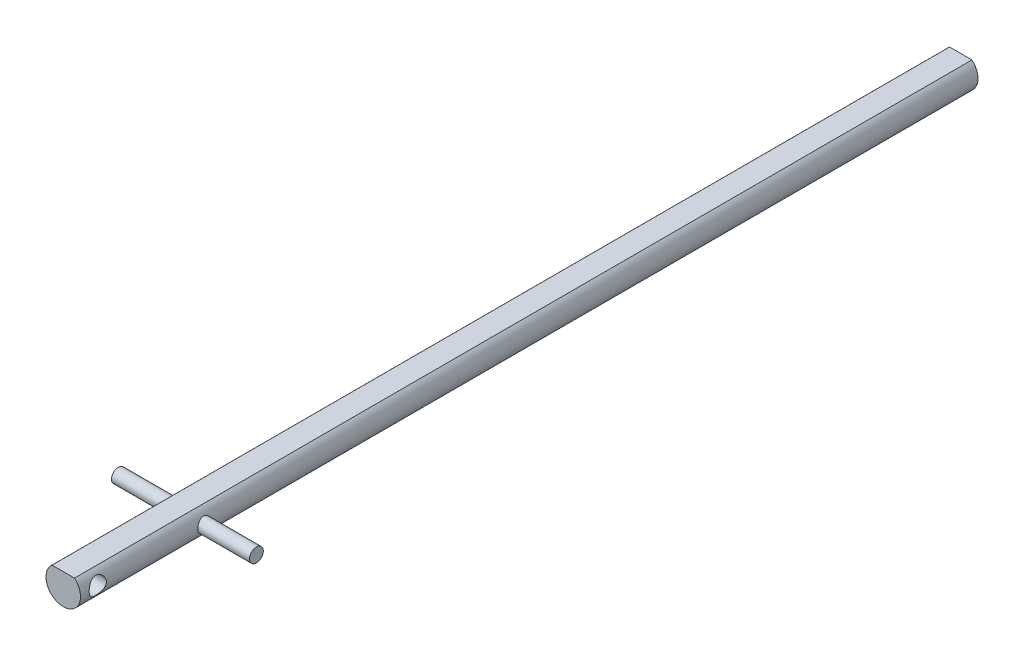
ISO-10303-21;
HEADER;
FILE_DESCRIPTION(('STEP AP214'),'2;1');
FILE_NAME('part.step','',(''),(''),'','','');
FILE_SCHEMA(('AUTOMOTIVE_DESIGN { 1 0 10303 214 1 1 1 1 }'));
ENDSEC;
DATA;
#1=APPLICATION_CONTEXT('core data for automotive mechanical design processes');
#2=APPLICATION_PROTOCOL_DEFINITION('international standard','automotive_design',2000,#1);
#3=PRODUCT_CONTEXT('',#1,'mechanical');
#4=PRODUCT('Part','Part','',(#3));
#5=PRODUCT_RELATED_PRODUCT_CATEGORY('part','',(#4));
#6=PRODUCT_DEFINITION_FORMATION('','',#4);
#7=PRODUCT_DEFINITION_CONTEXT('part definition',#1,'design');
#8=PRODUCT_DEFINITION('design','',#6,#7);
#9=PRODUCT_DEFINITION_SHAPE('','',#8);
#10=(LENGTH_UNIT() NAMED_UNIT(*) SI_UNIT(.MILLI.,.METRE.));
#11=(NAMED_UNIT(*) PLANE_ANGLE_UNIT() SI_UNIT($,.RADIAN.));
#12=(NAMED_UNIT(*) SI_UNIT($,.STERADIAN.) SOLID_ANGLE_UNIT());
#13=UNCERTAINTY_MEASURE_WITH_UNIT(LENGTH_MEASURE(1.E-05),#10,'distance_accuracy_value','');
#14=(GEOMETRIC_REPRESENTATION_CONTEXT(3) GLOBAL_UNCERTAINTY_ASSIGNED_CONTEXT((#13)) GLOBAL_UNIT_ASSIGNED_CONTEXT((#10,
#11,#12)) REPRESENTATION_CONTEXT('',''));
#15=CARTESIAN_POINT('',(0.,0.,0.));
#16=DIRECTION('',(0.,0.,1.));
#17=DIRECTION('',(1.,0.,0.));
#18=AXIS2_PLACEMENT_3D('',#15,#16,#17);
#19=CARTESIAN_POINT('',(0.,0.,260.));
#20=DIRECTION('',(0.,0.,-1.));
#21=DIRECTION('',(-1.,0.,0.));
#22=AXIS2_PLACEMENT_3D('',#19,#20,#21);
#23=CYLINDRICAL_SURFACE('',#22,5.);
#24=CARTESIAN_POINT('',(5.,0.,226.038713000911));
#25=CARTESIAN_POINT('',(4.99999271227084,-0.107493005442891,226.038703149087));
#26=CARTESIAN_POINT('',(4.99649294306932,-0.215172564090672,226.029995248822));
#27=CARTESIAN_POINT('',(4.98283453100641,-0.427496480417894,225.995465297389));
#28=CARTESIAN_POINT('',(4.97265778698877,-0.532131777561247,225.969596721824));
#29=CARTESIAN_POINT('',(4.94674209213118,-0.7349539227274,225.901836922852));
#30=CARTESIAN_POINT('',(4.93102136364072,-0.833160661616954,225.859998154694));
#31=CARTESIAN_POINT('',(4.89556610796078,-1.02107197032836,225.761693827584));
#32=CARTESIAN_POINT('',(4.87583297458057,-1.11077947675098,225.705233345992));
#33=CARTESIAN_POINT('',(4.83330886170419,-1.28350100757038,225.57647750235));
#34=CARTESIAN_POINT('',(4.81042296929191,-1.3660622725502,225.50360634467));
#35=CARTESIAN_POINT('',(4.76460576906195,-1.51817500478471,225.345312997434));
#36=CARTESIAN_POINT('',(4.74167444453793,-1.58772010713352,225.259884703699));
#37=CARTESIAN_POINT('',(4.69722791797136,-1.71487456729287,225.074284930668));
#38=CARTESIAN_POINT('',(4.67582115964952,-1.77181498119546,224.973626514887));
#39=CARTESIAN_POINT('',(4.63833647186793,-1.86775471903714,224.763176602491));
#40=CARTESIAN_POINT('',(4.62225601244176,-1.90676256428583,224.653389473062));
#41=CARTESIAN_POINT('',(4.59826357660818,-1.96389882339587,224.433000667318));
#42=CARTESIAN_POINT('',(4.59001420355605,-1.98289396580564,224.322661765334));
#43=CARTESIAN_POINT('',(4.58164004049144,-2.00217296164002,224.100078002603));
#44=CARTESIAN_POINT('',(4.58151125522768,-2.00246601631322,223.987834106286));
#45=CARTESIAN_POINT('',(4.58910500279994,-1.98498936750455,223.772956329453));
#46=CARTESIAN_POINT('',(4.5962817503845,-1.96847531430514,223.670197286502));
#47=CARTESIAN_POINT('',(4.61676187607836,-1.91994688029782,223.469053444904));
#48=CARTESIAN_POINT('',(4.63006632321673,-1.88792979480463,223.3706694128));
#49=CARTESIAN_POINT('',(4.6615948508853,-1.80869473255108,223.178695164715));
#50=CARTESIAN_POINT('',(4.67991379280788,-1.76117986231532,223.085243761856));
#51=CARTESIAN_POINT('',(4.7193811638989,-1.65250646073221,222.907297184549));
#52=CARTESIAN_POINT('',(4.74053065456848,-1.59134280510084,222.822805391508));
#53=CARTESIAN_POINT('',(4.7852673674227,-1.45155059945444,222.658303272109));
#54=CARTESIAN_POINT('',(4.80891664976151,-1.37193746297065,222.579144271465));
#55=CARTESIAN_POINT('',(4.85459824958281,-1.20031442743021,222.435028522909));
#56=CARTESIAN_POINT('',(4.87663024445324,-1.10830206533445,222.3700746035));
#57=CARTESIAN_POINT('',(4.91714681264548,-0.912077652605853,222.255095553495));
#58=CARTESIAN_POINT('',(4.93555270095414,-0.807660491346491,222.205390719714));
#59=CARTESIAN_POINT('',(4.96614828328759,-0.591023765482894,222.124545139833));
#60=CARTESIAN_POINT('',(4.97834113462382,-0.478808196849682,222.093394963353));
#61=CARTESIAN_POINT('',(4.9945613950691,-0.256895887607824,222.052264705491));
#62=CARTESIAN_POINT('',(4.99902945833514,-0.147443293985539,222.041140546657));
#63=CARTESIAN_POINT('',(5.00068478510631,0.0718453098078124,222.036999900382));
#64=CARTESIAN_POINT('',(4.99787393582291,0.181681213223919,222.043978719363));
#65=CARTESIAN_POINT('',(4.98557567063753,0.393432739121984,222.075004753463));
#66=CARTESIAN_POINT('',(4.97639391345523,0.495482491775472,222.098270981262));
#67=CARTESIAN_POINT('',(4.952594414055,0.694135428060778,222.16014870922));
#68=CARTESIAN_POINT('',(4.9379759735653,0.790737910224842,222.198762180579));
#69=CARTESIAN_POINT('',(4.90416594770812,0.979078785816701,222.291497940591));
#70=CARTESIAN_POINT('',(4.88484815979803,1.07057802275541,222.346058472954));
#71=CARTESIAN_POINT('',(4.84373364745525,1.24344359124656,222.468653324816));
#72=CARTESIAN_POINT('',(4.8219359311027,1.32480584076113,222.536693043833));
#73=CARTESIAN_POINT('',(4.77645117638112,1.48072304302882,222.68958301386));
#74=CARTESIAN_POINT('',(4.75273441425052,1.55447393380607,222.775246542417));
#75=CARTESIAN_POINT('',(4.70741672917132,1.68675119741371,222.95815308392));
#76=CARTESIAN_POINT('',(4.68581615526511,1.74527506133751,223.055398001251));
#77=CARTESIAN_POINT('',(4.64714299907709,1.84580750193162,223.260174695505));
#78=CARTESIAN_POINT('',(4.63011630884788,1.88765059453445,223.367797000123));
#79=CARTESIAN_POINT('',(4.60323673477932,1.9522962197053,223.589446652626));
#80=CARTESIAN_POINT('',(4.59337855695998,1.97511280526931,223.703469206723));
#81=CARTESIAN_POINT('',(4.58271759299927,1.99971561727839,223.925840902685));
#82=CARTESIAN_POINT('',(4.58131421008172,2.00289708230286,224.034007840504));
#83=CARTESIAN_POINT('',(4.58614836033098,1.99180315927752,224.249257858624));
#84=CARTESIAN_POINT('',(4.59238492324793,1.97752998791378,224.356341074813));
#85=CARTESIAN_POINT('',(4.61126649079021,1.93307136615365,224.562045190766));
#86=CARTESIAN_POINT('',(4.62364831827449,1.90353749357098,224.660833275344));
#87=CARTESIAN_POINT('',(4.65324001232696,1.83000544849102,224.852091630524));
#88=CARTESIAN_POINT('',(4.67045121206006,1.78600328139382,224.94456014781));
#89=CARTESIAN_POINT('',(4.70898609604491,1.68187276275974,225.126322620181));
#90=CARTESIAN_POINT('',(4.73048882313242,1.62096533515949,225.215131671041));
#91=CARTESIAN_POINT('',(4.77463804372237,1.48589211927149,225.381706318114));
#92=CARTESIAN_POINT('',(4.79728488048406,1.41172233481813,225.459468573039));
#93=CARTESIAN_POINT('',(4.84293567087394,1.24650550627247,225.606915854174));
#94=CARTESIAN_POINT('',(4.86586757962185,1.15467600114614,225.675750307809));
#95=CARTESIAN_POINT('',(4.90800406713717,0.95990032028578,225.797050043532));
#96=CARTESIAN_POINT('',(4.92720691092906,0.856949004547245,225.849507713063));
#97=CARTESIAN_POINT('',(4.95939714815861,0.644738062495213,225.935335216101));
#98=CARTESIAN_POINT('',(4.97249363055028,0.535631618219702,225.969042324471));
#99=CARTESIAN_POINT('',(4.99144306209366,0.312876546281223,226.017352121865));
#100=CARTESIAN_POINT('',(4.99731899495638,0.199243525858915,226.032015437655));
#101=CARTESIAN_POINT('',(4.99975899504136,0.0569122978909315,226.038108381889));
#102=CARTESIAN_POINT('',(5.00000192969176,0.0284626887407593,226.03871560954));
#103=CARTESIAN_POINT('',(5.,0.,226.038713000911));
#104=B_SPLINE_CURVE_WITH_KNOTS('',3,(#24,#25,#26,#27,#28,#29,#30,#31,#32,#33,#34,#35,#36,#37,
#38,#39,#40,#41,#42,#43,#44,#45,#46,#47,#48,#49,#50,#51,#52,#53,#54,#55,#56,#57,#58,#59,#60,#61,
#62,#63,#64,#65,#66,#67,#68,#69,#70,#71,#72,#73,#74,#75,#76,#77,#78,#79,#80,#81,#82,#83,#84,#85,
#86,#87,#88,#89,#90,#91,#92,#93,#94,#95,#96,#97,#98,#99,#100,#101,#102,#103),.UNSPECIFIED.,.T.,
.F.,(4,2,2,2,2,2,2,2,2,2,2,2,2,2,2,2,2,2,2,2,2,2,2,2,2,2,2,2,2,2,2,2,2,2,2,2,2,2,2,4),(0.,
0.322402987893068,0.645683636007934,0.967911457471578,1.29002753567984,1.62597381700394,
1.9620839493441,2.31315258819216,2.66405423118269,2.99904105308828,3.33386306340483,
3.6453832840137,3.95695787256046,4.27489126298814,4.59294421938181,4.93558349186554,
5.27829092839729,5.62776913162804,5.97706956113789,6.30569184528006,6.63422893570081,
6.94800455564364,7.26182048993795,7.58523513398262,7.90877959498968,8.25368474624413,
8.59864669043749,8.94695045140825,9.29499672645931,9.61799673392744,9.94095572563044,
10.2511431854876,10.5614163580516,10.8894546805669,11.2175920134839,11.5670042353383,
11.9165786364053,12.2596430101332,12.6016125240434,12.6869804589679),.UNSPECIFIED.);
#105=CARTESIAN_POINT('',(5.,0.,226.038713000911));
#106=VERTEX_POINT('',#105);
#107=EDGE_CURVE('E42',#106,#106,#104,.T.);
#108=ORIENTED_EDGE('',*,*,#107,.F.);
#109=EDGE_LOOP('',(#108));
#110=FACE_BOUND('',#109,.T.);
#111=CARTESIAN_POINT('',(-5.,0.,252.5));
#112=CARTESIAN_POINT('',(-4.99999177550472,0.131426682334307,252.500009669056));
#113=CARTESIAN_POINT('',(-4.99476199135277,0.263015634437214,252.510425561774));
#114=CARTESIAN_POINT('',(-4.9743541856102,0.522301454622884,252.551631821162));
#115=CARTESIAN_POINT('',(-4.9591572718767,0.649990448564107,252.582460880925));
#116=CARTESIAN_POINT('',(-4.92040690922476,0.897333631316209,252.662984622719));
#117=CARTESIAN_POINT('',(-4.89688595907259,1.01701694536278,252.712605987783));
#118=CARTESIAN_POINT('',(-4.84364443325827,1.24618160399672,252.828926526252));
#119=CARTESIAN_POINT('',(-4.8139243464442,1.35566375203771,252.895624353145));
#120=CARTESIAN_POINT('',(-4.74890645050631,1.56876952630999,253.048793131643));
#121=CARTESIAN_POINT('',(-4.7133799765909,1.67163802294311,253.13621620023));
#122=CARTESIAN_POINT('',(-4.6414992577673,1.86194861703335,253.326303695985));
#123=CARTESIAN_POINT('',(-4.60514440566896,1.94937895911558,253.42897962884));
#124=CARTESIAN_POINT('',(-4.5324737794562,2.1131299996725,253.656208374445));
#125=CARTESIAN_POINT('',(-4.49637967412565,2.18806333849068,253.781840246035));
#126=CARTESIAN_POINT('',(-4.43214946943553,2.31542056761495,254.045918339795));
#127=CARTESIAN_POINT('',(-4.4040076902079,2.36786053751685,254.184355321763));
#128=CARTESIAN_POINT('',(-4.36144667591401,2.44533110537654,254.461662763596));
#129=CARTESIAN_POINT('',(-4.34630678958451,2.4718146426758,254.60001113018));
#130=CARTESIAN_POINT('',(-4.32954724872149,2.50106748329743,254.879947094438));
#131=CARTESIAN_POINT('',(-4.32791423358428,2.50386022093908,255.021531352175));
#132=CARTESIAN_POINT('',(-4.33777325642935,2.48671821792514,255.285715060791));
#133=CARTESIAN_POINT('',(-4.34771909154983,2.46946139884058,255.408560078058));
#134=CARTESIAN_POINT('',(-4.37690571834673,2.41734962264387,255.649304773432));
#135=CARTESIAN_POINT('',(-4.39614947079452,2.38248905974457,255.767202863263));
#136=CARTESIAN_POINT('',(-4.44218691031837,2.29552445096462,255.998072831414));
#137=CARTESIAN_POINT('',(-4.46914601659991,2.2430376677899,256.110865996965));
#138=CARTESIAN_POINT('',(-4.52758510703512,2.12260421917014,256.326585731475));
#139=CARTESIAN_POINT('',(-4.55906711950476,2.05465060953123,256.429507839));
#140=CARTESIAN_POINT('',(-4.62782894758212,1.89516513728196,256.636303131858));
#141=CARTESIAN_POINT('',(-4.66533775591864,1.80173614592322,256.73864218394));
#142=CARTESIAN_POINT('',(-4.73869058251018,1.59888894685347,256.926838546477));
#143=CARTESIAN_POINT('',(-4.77453379897002,1.48946314143575,257.012687980085));
#144=CARTESIAN_POINT('',(-4.84254968207408,1.25129126457966,257.169214152574));
#145=CARTESIAN_POINT('',(-4.87447460405014,1.12188397899857,257.239001181114));
#146=CARTESIAN_POINT('',(-4.92894702803108,0.851165538722017,257.355242572607));
#147=CARTESIAN_POINT('',(-4.95150197358893,0.709863940663192,257.401715462538));
#148=CARTESIAN_POINT('',(-4.98310834353579,0.431916229151808,257.466188509292));
#149=CARTESIAN_POINT('',(-4.9931234575324,0.295853826370934,257.486228089367));
#150=CARTESIAN_POINT('',(-5.00182533647793,0.0219489998733153,257.503661827836));
#151=CARTESIAN_POINT('',(-5.00051746803426,-0.115892549675083,257.501066714099));
#152=CARTESIAN_POINT('',(-4.98727980633468,-0.378082429964635,257.474483278953));
#153=CARTESIAN_POINT('',(-4.97618114219992,-0.50264852012369,257.452168668176));
#154=CARTESIAN_POINT('',(-4.94555428287529,-0.746017230755962,257.389404820262));
#155=CARTESIAN_POINT('',(-4.92602515837625,-0.864819214231875,257.348953583864));
#156=CARTESIAN_POINT('',(-4.87960628532329,-1.09722152111965,257.25000383392));
#157=CARTESIAN_POINT('',(-4.85252204417873,-1.21057599249831,257.191022374718));
#158=CARTESIAN_POINT('',(-4.7935993579975,-1.42615340426439,257.057231160875));
#159=CARTESIAN_POINT('',(-4.76175888940534,-1.52837157450204,256.98241466348));
#160=CARTESIAN_POINT('',(-4.69270553315086,-1.72941922315488,256.810598936709));
#161=CARTESIAN_POINT('',(-4.65527212009487,-1.82693019428497,256.712142829025));
#162=CARTESIAN_POINT('',(-4.58155978921586,-2.00464080257221,256.500187121951));
#163=CARTESIAN_POINT('',(-4.54528168472407,-2.08482846428686,256.38667720293));
#164=CARTESIAN_POINT('',(-4.47627980545279,-2.22926978618997,256.140890864515));
#165=CARTESIAN_POINT('',(-4.44381323981252,-2.29256373922246,256.007971834709));
#166=CARTESIAN_POINT('',(-4.38935180726744,-2.39520706511461,255.731224831117));
#167=CARTESIAN_POINT('',(-4.36734345549012,-2.43458729077058,255.587411184));
#168=CARTESIAN_POINT('',(-4.3390375256935,-2.48465421767007,255.307724442637));
#169=CARTESIAN_POINT('',(-4.33143458674095,-2.49773248744362,255.172414365881));
#170=CARTESIAN_POINT('',(-4.32913386592578,-2.50172288950901,254.901382332619));
#171=CARTESIAN_POINT('',(-4.33443049025109,-2.49264462983268,254.765660580126));
#172=CARTESIAN_POINT('',(-4.35594655164661,-2.45481530197334,254.511291244383));
#173=CARTESIAN_POINT('',(-4.37107736338131,-2.42802074302699,254.392248818279));
#174=CARTESIAN_POINT('',(-4.40927540337601,-2.35793843840547,254.1604797078));
#175=CARTESIAN_POINT('',(-4.43234518434963,-2.31464538728736,254.047755068433));
#176=CARTESIAN_POINT('',(-4.48571326433411,-2.20953919315541,253.82343784728));
#177=CARTESIAN_POINT('',(-4.51639307998449,-2.14667719009404,253.712430148265));
#178=CARTESIAN_POINT('',(-4.58088327077455,-2.0053780838799,253.50181375676));
#179=CARTESIAN_POINT('',(-4.61469526970766,-1.92693287765889,253.402211037371));
#180=CARTESIAN_POINT('',(-4.6865581632701,-1.74550556946067,253.20464463625));
#181=CARTESIAN_POINT('',(-4.7246249151498,-1.64070022469211,253.108350635829));
#182=CARTESIAN_POINT('',(-4.79694347383544,-1.41539785420687,252.934344150572));
#183=CARTESIAN_POINT('',(-4.83119321905445,-1.29489242426337,252.856641681394));
#184=CARTESIAN_POINT('',(-4.89245149457781,-1.03978808878541,252.721903020516));
#185=CARTESIAN_POINT('',(-4.91940711437487,-0.905095560782326,252.665016832216));
#186=CARTESIAN_POINT('',(-4.9517796092335,-0.696328709257392,252.597816141208));
#187=CARTESIAN_POINT('',(-4.96122314081873,-0.625670413494133,252.578444601998));
#188=CARTESIAN_POINT('',(-4.977171272751,-0.482623997839295,252.545934051629));
#189=CARTESIAN_POINT('',(-4.98367766823158,-0.410236963092427,252.532791233324));
#190=CARTESIAN_POINT('',(-4.9923820076613,-0.281518684621686,252.515262527715));
#191=CARTESIAN_POINT('',(-4.99523288466454,-0.225408499555459,252.509545063469));
#192=CARTESIAN_POINT('',(-4.99904367329658,-0.112875528456297,252.501911670534));
#193=CARTESIAN_POINT('',(-5.00000353273198,-0.056452733838222,252.499995846775));
#194=CARTESIAN_POINT('',(-5.,0.,252.5));
#195=B_SPLINE_CURVE_WITH_KNOTS('',3,(#111,#112,#113,#114,#115,#116,#117,#118,#119,#120,#121,
#122,#123,#124,#125,#126,#127,#128,#129,#130,#131,#132,#133,#134,#135,#136,#137,#138,#139,#140,
#141,#142,#143,#144,#145,#146,#147,#148,#149,#150,#151,#152,#153,#154,#155,#156,#157,#158,#159,
#160,#161,#162,#163,#164,#165,#166,#167,#168,#169,#170,#171,#172,#173,#174,#175,#176,#177,#178,
#179,#180,#181,#182,#183,#184,#185,#186,#187,#188,#189,#190,#191,#192,#193,#194),.UNSPECIFIED.,
.T.,.F.,(4,2,2,2,2,2,2,2,2,2,2,2,2,2,2,2,2,2,2,2,2,2,2,2,2,2,2,2,2,2,2,2,2,2,2,2,2,2,2,2,2,4),
(0.,0.39406064355073,0.788870374272996,1.18215538873077,1.57540940145393,1.99245439679524,
2.4098155941351,2.85954316076887,3.30894869745711,3.7314503035057,4.15353393322552,
4.52514281023302,4.89687009814196,5.27725600421222,5.6578130315056,6.08662353334701,
6.51563836496716,6.96457555536105,7.41315542280703,7.82458226178368,8.23581411278694,
8.61517266265311,8.99457304077334,9.38482140069756,9.77523626870852,10.2039902661038,
10.6330397153796,11.082867054037,11.5321127986301,11.9382326875699,12.3441764966107,
12.7114482562152,13.0788382197025,13.470911419501,13.8631890285846,14.3031310689231,
14.7433095845249,15.1866003415819,15.4079349392081,15.6291340766844,15.7983933645036,
15.9676573239324),.UNSPECIFIED.);
#196=CARTESIAN_POINT('',(-5.,0.,252.5));
#197=VERTEX_POINT('',#196);
#198=EDGE_CURVE('E89',#197,#197,#195,.T.);
#199=ORIENTED_EDGE('',*,*,#198,.T.);
#200=EDGE_LOOP('',(#199));
#201=FACE_BOUND('',#200,.T.);
#202=CARTESIAN_POINT('',(5.,0.,252.5));
#203=CARTESIAN_POINT('',(4.99999177550472,-0.131426682334307,252.500009669056));
#204=CARTESIAN_POINT('',(4.99476199135277,-0.263015634437214,252.510425561774));
#205=CARTESIAN_POINT('',(4.9743541856102,-0.522301454622884,252.551631821162));
#206=CARTESIAN_POINT('',(4.9591572718767,-0.649990448564107,252.582460880925));
#207=CARTESIAN_POINT('',(4.92040690922476,-0.897333631316209,252.662984622719));
#208=CARTESIAN_POINT('',(4.89688595907259,-1.01701694536278,252.712605987783));
#209=CARTESIAN_POINT('',(4.84364443325827,-1.24618160399672,252.828926526252));
#210=CARTESIAN_POINT('',(4.8139243464442,-1.35566375203771,252.895624353145));
#211=CARTESIAN_POINT('',(4.74890645050631,-1.56876952630999,253.048793131643));
#212=CARTESIAN_POINT('',(4.7133799765909,-1.67163802294311,253.13621620023));
#213=CARTESIAN_POINT('',(4.6414992577673,-1.86194861703335,253.326303695985));
#214=CARTESIAN_POINT('',(4.60514440566896,-1.94937895911558,253.42897962884));
#215=CARTESIAN_POINT('',(4.5324737794562,-2.1131299996725,253.656208374445));
#216=CARTESIAN_POINT('',(4.49637967412565,-2.18806333849068,253.781840246035));
#217=CARTESIAN_POINT('',(4.43214946943553,-2.31542056761495,254.045918339795));
#218=CARTESIAN_POINT('',(4.4040076902079,-2.36786053751685,254.184355321763));
#219=CARTESIAN_POINT('',(4.36144667591401,-2.44533110537654,254.461662763596));
#220=CARTESIAN_POINT('',(4.34630678958451,-2.4718146426758,254.60001113018));
#221=CARTESIAN_POINT('',(4.32954724872149,-2.50106748329743,254.879947094438));
#222=CARTESIAN_POINT('',(4.32791423358428,-2.50386022093908,255.021531352175));
#223=CARTESIAN_POINT('',(4.33777325642935,-2.48671821792514,255.285715060791));
#224=CARTESIAN_POINT('',(4.34771909154983,-2.46946139884058,255.408560078058));
#225=CARTESIAN_POINT('',(4.37690571834673,-2.41734962264387,255.649304773432));
#226=CARTESIAN_POINT('',(4.39614947079452,-2.38248905974457,255.767202863263));
#227=CARTESIAN_POINT('',(4.44218691031837,-2.29552445096462,255.998072831414));
#228=CARTESIAN_POINT('',(4.46914601659991,-2.2430376677899,256.110865996965));
#229=CARTESIAN_POINT('',(4.52758510703512,-2.12260421917014,256.326585731475));
#230=CARTESIAN_POINT('',(4.55906711950476,-2.05465060953123,256.429507839));
#231=CARTESIAN_POINT('',(4.62782894758212,-1.89516513728196,256.636303131858));
#232=CARTESIAN_POINT('',(4.66533775591864,-1.80173614592322,256.73864218394));
#233=CARTESIAN_POINT('',(4.73869058251018,-1.59888894685347,256.926838546477));
#234=CARTESIAN_POINT('',(4.77453379897002,-1.48946314143575,257.012687980085));
#235=CARTESIAN_POINT('',(4.84254968207408,-1.25129126457966,257.169214152574));
#236=CARTESIAN_POINT('',(4.87447460405014,-1.12188397899857,257.239001181114));
#237=CARTESIAN_POINT('',(4.92894702803108,-0.851165538722017,257.355242572607));
#238=CARTESIAN_POINT('',(4.95150197358893,-0.709863940663192,257.401715462538));
#239=CARTESIAN_POINT('',(4.98310834353579,-0.431916229151808,257.466188509292));
#240=CARTESIAN_POINT('',(4.9931234575324,-0.295853826370934,257.486228089367));
#241=CARTESIAN_POINT('',(5.00182533647793,-0.0219489998733153,257.503661827836));
#242=CARTESIAN_POINT('',(5.00051746803426,0.115892549675083,257.501066714099));
#243=CARTESIAN_POINT('',(4.98727980633468,0.378082429964635,257.474483278953));
#244=CARTESIAN_POINT('',(4.97618114219992,0.50264852012369,257.452168668176));
#245=CARTESIAN_POINT('',(4.94555428287529,0.746017230755962,257.389404820262));
#246=CARTESIAN_POINT('',(4.92602515837625,0.864819214231875,257.348953583864));
#247=CARTESIAN_POINT('',(4.87960628532329,1.09722152111965,257.25000383392));
#248=CARTESIAN_POINT('',(4.85252204417873,1.21057599249831,257.191022374718));
#249=CARTESIAN_POINT('',(4.7935993579975,1.42615340426439,257.057231160875));
#250=CARTESIAN_POINT('',(4.76175888940534,1.52837157450204,256.98241466348));
#251=CARTESIAN_POINT('',(4.69270553315086,1.72941922315488,256.810598936709));
#252=CARTESIAN_POINT('',(4.65527212009487,1.82693019428497,256.712142829025));
#253=CARTESIAN_POINT('',(4.58155978921586,2.00464080257221,256.500187121951));
#254=CARTESIAN_POINT('',(4.54528168472407,2.08482846428686,256.38667720293));
#255=CARTESIAN_POINT('',(4.47627980545279,2.22926978618997,256.140890864515));
#256=CARTESIAN_POINT('',(4.44381323981252,2.29256373922246,256.007971834709));
#257=CARTESIAN_POINT('',(4.38935180726744,2.39520706511461,255.731224831117));
#258=CARTESIAN_POINT('',(4.36734345549012,2.43458729077058,255.587411184));
#259=CARTESIAN_POINT('',(4.3390375256935,2.48465421767007,255.307724442637));
#260=CARTESIAN_POINT('',(4.33143458674095,2.49773248744362,255.172414365881));
#261=CARTESIAN_POINT('',(4.32913386592578,2.50172288950901,254.901382332619));
#262=CARTESIAN_POINT('',(4.33443049025109,2.49264462983268,254.765660580126));
#263=CARTESIAN_POINT('',(4.35594655164661,2.45481530197334,254.511291244383));
#264=CARTESIAN_POINT('',(4.37107736338131,2.42802074302699,254.392248818279));
#265=CARTESIAN_POINT('',(4.40927540337601,2.35793843840547,254.1604797078));
#266=CARTESIAN_POINT('',(4.43234518434963,2.31464538728736,254.047755068433));
#267=CARTESIAN_POINT('',(4.48571326433411,2.20953919315541,253.82343784728));
#268=CARTESIAN_POINT('',(4.51639307998449,2.14667719009404,253.712430148265));
#269=CARTESIAN_POINT('',(4.58088327077455,2.0053780838799,253.50181375676));
#270=CARTESIAN_POINT('',(4.61469526970766,1.92693287765889,253.402211037371));
#271=CARTESIAN_POINT('',(4.6865581632701,1.74550556946067,253.20464463625));
#272=CARTESIAN_POINT('',(4.7246249151498,1.64070022469211,253.108350635829));
#273=CARTESIAN_POINT('',(4.79694347383544,1.41539785420687,252.934344150572));
#274=CARTESIAN_POINT('',(4.83119321905445,1.29489242426337,252.856641681394));
#275=CARTESIAN_POINT('',(4.89245149457781,1.03978808878541,252.721903020516));
#276=CARTESIAN_POINT('',(4.91940711437487,0.905095560782326,252.665016832216));
#277=CARTESIAN_POINT('',(4.9517796092335,0.696328709257392,252.597816141208));
#278=CARTESIAN_POINT('',(4.96122314081873,0.625670413494133,252.578444601998));
#279=CARTESIAN_POINT('',(4.977171272751,0.482623997839295,252.545934051629));
#280=CARTESIAN_POINT('',(4.98367766823158,0.410236963092427,252.532791233324));
#281=CARTESIAN_POINT('',(4.9923820076613,0.281518684621686,252.515262527715));
#282=CARTESIAN_POINT('',(4.99523288466454,0.225408499555459,252.509545063469));
#283=CARTESIAN_POINT('',(4.99904367329658,0.112875528456297,252.501911670534));
#284=CARTESIAN_POINT('',(5.00000353273198,0.056452733838222,252.499995846775));
#285=CARTESIAN_POINT('',(5.,0.,252.5));
#286=B_SPLINE_CURVE_WITH_KNOTS('',3,(#202,#203,#204,#205,#206,#207,#208,#209,#210,#211,#212,
#213,#214,#215,#216,#217,#218,#219,#220,#221,#222,#223,#224,#225,#226,#227,#228,#229,#230,#231,
#232,#233,#234,#235,#236,#237,#238,#239,#240,#241,#242,#243,#244,#245,#246,#247,#248,#249,#250,
#251,#252,#253,#254,#255,#256,#257,#258,#259,#260,#261,#262,#263,#264,#265,#266,#267,#268,#269,
#270,#271,#272,#273,#274,#275,#276,#277,#278,#279,#280,#281,#282,#283,#284,#285),.UNSPECIFIED.,
.T.,.F.,(4,2,2,2,2,2,2,2,2,2,2,2,2,2,2,2,2,2,2,2,2,2,2,2,2,2,2,2,2,2,2,2,2,2,2,2,2,2,2,2,2,4),
(0.,0.39406064355073,0.788870374272996,1.18215538873077,1.57540940145393,1.99245439679524,
2.4098155941351,2.85954316076887,3.30894869745711,3.7314503035057,4.15353393322552,
4.52514281023302,4.89687009814196,5.27725600421222,5.6578130315056,6.08662353334701,
6.51563836496716,6.96457555536105,7.41315542280703,7.82458226178368,8.23581411278694,
8.61517266265311,8.99457304077334,9.38482140069756,9.77523626870852,10.2039902661038,
10.6330397153796,11.082867054037,11.5321127986301,11.9382326875699,12.3441764966107,
12.7114482562152,13.0788382197025,13.470911419501,13.8631890285846,14.3031310689231,
14.7433095845249,15.1866003415819,15.4079349392081,15.6291340766844,15.7983933645036,
15.9676573239324),.UNSPECIFIED.);
#287=CARTESIAN_POINT('',(5.,0.,252.5));
#288=VERTEX_POINT('',#287);
#289=EDGE_CURVE('E83',#288,#288,#286,.T.);
#290=ORIENTED_EDGE('',*,*,#289,.T.);
#291=EDGE_LOOP('',(#290));
#292=FACE_BOUND('',#291,.T.);
#293=CARTESIAN_POINT('',(0.,0.,0.));
#294=DIRECTION('',(0.,0.,1.));
#295=DIRECTION('',(1.,0.,0.));
#296=AXIS2_PLACEMENT_3D('',#293,#294,#295);
#297=CIRCLE('',#296,5.);
#298=CARTESIAN_POINT('',(-3.24961536185438,3.8,0.));
#299=VERTEX_POINT('',#298);
#300=CARTESIAN_POINT('',(3.24961536185438,3.8,0.));
#301=VERTEX_POINT('',#300);
#302=EDGE_CURVE('E68',#299,#301,#297,.T.);
#303=ORIENTED_EDGE('',*,*,#302,.T.);
#304=DIRECTION('',(0.,0.,-1.));
#305=VECTOR('',#304,1.);
#306=CARTESIAN_POINT('',(3.24961536185438,3.8,260.));
#307=LINE('',#306,#305);
#308=CARTESIAN_POINT('',(3.24961536185438,3.8,260.));
#309=VERTEX_POINT('',#308);
#310=EDGE_CURVE('E65',#309,#301,#307,.T.);
#311=ORIENTED_EDGE('',*,*,#310,.F.);
#312=CARTESIAN_POINT('',(0.,0.,260.));
#313=DIRECTION('',(0.,0.,1.));
#314=DIRECTION('',(1.,0.,0.));
#315=AXIS2_PLACEMENT_3D('',#312,#313,#314);
#316=CIRCLE('',#315,5.);
#317=CARTESIAN_POINT('',(-3.24961536185438,3.8,260.));
#318=VERTEX_POINT('',#317);
#319=EDGE_CURVE('E67',#318,#309,#316,.T.);
#320=ORIENTED_EDGE('',*,*,#319,.F.);
#321=DIRECTION('',(0.,0.,-1.));
#322=VECTOR('',#321,1.);
#323=CARTESIAN_POINT('',(-3.24961536185438,3.8,260.));
#324=LINE('',#323,#322);
#325=EDGE_CURVE('E62',#318,#299,#324,.T.);
#326=ORIENTED_EDGE('',*,*,#325,.T.);
#327=EDGE_LOOP('',(#303,#311,#320,#326));
#328=FACE_BOUND('',#327,.T.);
#329=CARTESIAN_POINT('',(-5.,0.,226.038713000911));
#330=CARTESIAN_POINT('',(-4.99999271227084,0.107493005442891,226.038703149087));
#331=CARTESIAN_POINT('',(-4.99649294306932,0.215172564090672,226.029995248822));
#332=CARTESIAN_POINT('',(-4.98283453100641,0.427496480417894,225.995465297389));
#333=CARTESIAN_POINT('',(-4.97265778698877,0.532131777561247,225.969596721824));
#334=CARTESIAN_POINT('',(-4.94674209213118,0.7349539227274,225.901836922852));
#335=CARTESIAN_POINT('',(-4.93102136364072,0.833160661616954,225.859998154694));
#336=CARTESIAN_POINT('',(-4.89556610796078,1.02107197032836,225.761693827584));
#337=CARTESIAN_POINT('',(-4.87583297458057,1.11077947675098,225.705233345992));
#338=CARTESIAN_POINT('',(-4.83330886170419,1.28350100757038,225.57647750235));
#339=CARTESIAN_POINT('',(-4.81042296929191,1.3660622725502,225.50360634467));
#340=CARTESIAN_POINT('',(-4.76460576906195,1.51817500478471,225.345312997434));
#341=CARTESIAN_POINT('',(-4.74167444453793,1.58772010713352,225.259884703699));
#342=CARTESIAN_POINT('',(-4.69722791797136,1.71487456729287,225.074284930668));
#343=CARTESIAN_POINT('',(-4.67582115964952,1.77181498119546,224.973626514887));
#344=CARTESIAN_POINT('',(-4.63833647186793,1.86775471903714,224.763176602491));
#345=CARTESIAN_POINT('',(-4.62225601244176,1.90676256428583,224.653389473062));
#346=CARTESIAN_POINT('',(-4.59826357660818,1.96389882339587,224.433000667318));
#347=CARTESIAN_POINT('',(-4.59001420355605,1.98289396580564,224.322661765334));
#348=CARTESIAN_POINT('',(-4.58164004049144,2.00217296164002,224.100078002603));
#349=CARTESIAN_POINT('',(-4.58151125522768,2.00246601631322,223.987834106286));
#350=CARTESIAN_POINT('',(-4.58910500279994,1.98498936750455,223.772956329453));
#351=CARTESIAN_POINT('',(-4.5962817503845,1.96847531430514,223.670197286502));
#352=CARTESIAN_POINT('',(-4.61676187607836,1.91994688029782,223.469053444904));
#353=CARTESIAN_POINT('',(-4.63006632321673,1.88792979480463,223.3706694128));
#354=CARTESIAN_POINT('',(-4.6615948508853,1.80869473255108,223.178695164715));
#355=CARTESIAN_POINT('',(-4.67991379280788,1.76117986231532,223.085243761856));
#356=CARTESIAN_POINT('',(-4.7193811638989,1.65250646073221,222.907297184549));
#357=CARTESIAN_POINT('',(-4.74053065456848,1.59134280510084,222.822805391508));
#358=CARTESIAN_POINT('',(-4.7852673674227,1.45155059945444,222.658303272109));
#359=CARTESIAN_POINT('',(-4.80891664976151,1.37193746297065,222.579144271465));
#360=CARTESIAN_POINT('',(-4.85459824958281,1.20031442743021,222.435028522909));
#361=CARTESIAN_POINT('',(-4.87663024445324,1.10830206533445,222.3700746035));
#362=CARTESIAN_POINT('',(-4.91714681264548,0.912077652605853,222.255095553495));
#363=CARTESIAN_POINT('',(-4.93555270095414,0.807660491346491,222.205390719714));
#364=CARTESIAN_POINT('',(-4.96614828328759,0.591023765482894,222.124545139833));
#365=CARTESIAN_POINT('',(-4.97834113462382,0.478808196849682,222.093394963353));
#366=CARTESIAN_POINT('',(-4.9945613950691,0.256895887607824,222.052264705491));
#367=CARTESIAN_POINT('',(-4.99902945833514,0.147443293985539,222.041140546657));
#368=CARTESIAN_POINT('',(-5.00068478510631,-0.0718453098078124,222.036999900382));
#369=CARTESIAN_POINT('',(-4.99787393582291,-0.181681213223919,222.043978719363));
#370=CARTESIAN_POINT('',(-4.98557567063753,-0.393432739121984,222.075004753463));
#371=CARTESIAN_POINT('',(-4.97639391345523,-0.495482491775472,222.098270981262));
#372=CARTESIAN_POINT('',(-4.952594414055,-0.694135428060778,222.16014870922));
#373=CARTESIAN_POINT('',(-4.9379759735653,-0.790737910224842,222.198762180579));
#374=CARTESIAN_POINT('',(-4.90416594770812,-0.979078785816701,222.291497940591));
#375=CARTESIAN_POINT('',(-4.88484815979803,-1.07057802275541,222.346058472954));
#376=CARTESIAN_POINT('',(-4.84373364745525,-1.24344359124656,222.468653324816));
#377=CARTESIAN_POINT('',(-4.8219359311027,-1.32480584076113,222.536693043833));
#378=CARTESIAN_POINT('',(-4.77645117638112,-1.48072304302882,222.68958301386));
#379=CARTESIAN_POINT('',(-4.75273441425052,-1.55447393380607,222.775246542417));
#380=CARTESIAN_POINT('',(-4.70741672917132,-1.68675119741371,222.95815308392));
#381=CARTESIAN_POINT('',(-4.68581615526511,-1.74527506133751,223.055398001251));
#382=CARTESIAN_POINT('',(-4.64714299907709,-1.84580750193162,223.260174695505));
#383=CARTESIAN_POINT('',(-4.63011630884788,-1.88765059453445,223.367797000123));
#384=CARTESIAN_POINT('',(-4.60323673477932,-1.9522962197053,223.589446652626));
#385=CARTESIAN_POINT('',(-4.59337855695998,-1.97511280526931,223.703469206723));
#386=CARTESIAN_POINT('',(-4.58271759299927,-1.99971561727839,223.925840902685));
#387=CARTESIAN_POINT('',(-4.58131421008172,-2.00289708230286,224.034007840504));
#388=CARTESIAN_POINT('',(-4.58614836033098,-1.99180315927752,224.249257858624));
#389=CARTESIAN_POINT('',(-4.59238492324793,-1.97752998791378,224.356341074813));
#390=CARTESIAN_POINT('',(-4.61126649079021,-1.93307136615365,224.562045190766));
#391=CARTESIAN_POINT('',(-4.62364831827449,-1.90353749357098,224.660833275344));
#392=CARTESIAN_POINT('',(-4.65324001232696,-1.83000544849102,224.852091630524));
#393=CARTESIAN_POINT('',(-4.67045121206006,-1.78600328139382,224.94456014781));
#394=CARTESIAN_POINT('',(-4.70898609604491,-1.68187276275974,225.126322620181));
#395=CARTESIAN_POINT('',(-4.73048882313242,-1.62096533515949,225.215131671041));
#396=CARTESIAN_POINT('',(-4.77463804372237,-1.48589211927149,225.381706318114));
#397=CARTESIAN_POINT('',(-4.79728488048406,-1.41172233481813,225.459468573039));
#398=CARTESIAN_POINT('',(-4.84293567087394,-1.24650550627247,225.606915854174));
#399=CARTESIAN_POINT('',(-4.86586757962185,-1.15467600114614,225.675750307809));
#400=CARTESIAN_POINT('',(-4.90800406713717,-0.95990032028578,225.797050043532));
#401=CARTESIAN_POINT('',(-4.92720691092906,-0.856949004547245,225.849507713063));
#402=CARTESIAN_POINT('',(-4.95939714815861,-0.644738062495213,225.935335216101));
#403=CARTESIAN_POINT('',(-4.97249363055028,-0.535631618219702,225.969042324471));
#404=CARTESIAN_POINT('',(-4.99144306209366,-0.312876546281223,226.017352121865));
#405=CARTESIAN_POINT('',(-4.99731899495638,-0.199243525858915,226.032015437655));
#406=CARTESIAN_POINT('',(-4.99975899504136,-0.0569122978909315,226.038108381889));
#407=CARTESIAN_POINT('',(-5.00000192969176,-0.0284626887407593,226.03871560954));
#408=CARTESIAN_POINT('',(-5.,0.,226.038713000911));
#409=B_SPLINE_CURVE_WITH_KNOTS('',3,(#329,#330,#331,#332,#333,#334,#335,#336,#337,#338,#339,
#340,#341,#342,#343,#344,#345,#346,#347,#348,#349,#350,#351,#352,#353,#354,#355,#356,#357,#358,
#359,#360,#361,#362,#363,#364,#365,#366,#367,#368,#369,#370,#371,#372,#373,#374,#375,#376,#377,
#378,#379,#380,#381,#382,#383,#384,#385,#386,#387,#388,#389,#390,#391,#392,#393,#394,#395,#396,
#397,#398,#399,#400,#401,#402,#403,#404,#405,#406,#407,#408),.UNSPECIFIED.,.T.,.F.,(4,2,2,2,2,2,
2,2,2,2,2,2,2,2,2,2,2,2,2,2,2,2,2,2,2,2,2,2,2,2,2,2,2,2,2,2,2,2,2,4),(0.,0.322402987893068,
0.645683636007934,0.967911457471578,1.29002753567984,1.62597381700394,1.9620839493441,
2.31315258819216,2.66405423118269,2.99904105308828,3.33386306340483,3.6453832840137,
3.95695787256046,4.27489126298814,4.59294421938181,4.93558349186554,5.27829092839729,
5.62776913162804,5.97706956113789,6.30569184528006,6.63422893570081,6.94800455564364,
7.26182048993795,7.58523513398262,7.90877959498968,8.25368474624413,8.59864669043749,
8.94695045140825,9.29499672645931,9.61799673392744,9.94095572563044,10.2511431854876,
10.5614163580516,10.8894546805669,11.2175920134839,11.5670042353383,11.9165786364053,
12.2596430101332,12.6016125240434,12.6869804589679),.UNSPECIFIED.);
#410=CARTESIAN_POINT('',(-5.,0.,226.038713000911));
#411=VERTEX_POINT('',#410);
#412=EDGE_CURVE('E11',#411,#411,#409,.T.);
#413=ORIENTED_EDGE('',*,*,#412,.F.);
#414=EDGE_LOOP('',(#413));
#415=FACE_BOUND('',#414,.T.);
#416=ADVANCED_FACE('F30',(#110,#201,#292,#328,#415),#23,.T.);
#417=CARTESIAN_POINT('',(-3.24961536185438,3.8,260.));
#418=DIRECTION('',(0.,-1.,0.));
#419=DIRECTION('',(1.,0.,0.));
#420=AXIS2_PLACEMENT_3D('',#417,#418,#419);
#421=PLANE('',#420);
#422=DIRECTION('',(-1.,0.,0.));
#423=VECTOR('',#422,1.);
#424=CARTESIAN_POINT('',(-3.24961536185438,3.8,0.));
#425=LINE('',#424,#423);
#426=EDGE_CURVE('E57',#301,#299,#425,.T.);
#427=ORIENTED_EDGE('',*,*,#426,.T.);
#428=ORIENTED_EDGE('',*,*,#325,.F.);
#429=DIRECTION('',(-1.,0.,0.));
#430=VECTOR('',#429,1.);
#431=CARTESIAN_POINT('',(-3.24961536185438,3.8,260.));
#432=LINE('',#431,#430);
#433=EDGE_CURVE('E49',#309,#318,#432,.T.);
#434=ORIENTED_EDGE('',*,*,#433,.F.);
#435=ORIENTED_EDGE('',*,*,#310,.T.);
#436=EDGE_LOOP('',(#427,#428,#434,#435));
#437=FACE_BOUND('',#436,.T.);
#438=ADVANCED_FACE('F61',(#437),#421,.F.);
#439=CARTESIAN_POINT('',(0.,0.,260.));
#440=DIRECTION('',(0.,0.,1.));
#441=DIRECTION('',(1.,0.,0.));
#442=AXIS2_PLACEMENT_3D('',#439,#440,#441);
#443=PLANE('',#442);
#444=ORIENTED_EDGE('',*,*,#319,.T.);
#445=ORIENTED_EDGE('',*,*,#433,.T.);
#446=EDGE_LOOP('',(#444,#445));
#447=FACE_BOUND('',#446,.T.);
#448=ADVANCED_FACE('F101',(#447),#443,.T.);
#449=CARTESIAN_POINT('',(0.,0.,0.));
#450=DIRECTION('',(0.,0.,1.));
#451=DIRECTION('',(1.,0.,0.));
#452=AXIS2_PLACEMENT_3D('',#449,#450,#451);
#453=PLANE('',#452);
#454=ORIENTED_EDGE('',*,*,#302,.F.);
#455=ORIENTED_EDGE('',*,*,#426,.F.);
#456=EDGE_LOOP('',(#454,#455));
#457=FACE_BOUND('',#456,.T.);
#458=ADVANCED_FACE('F73',(#457),#453,.F.);
#459=CARTESIAN_POINT('',(-5.,0.,255.));
#460=DIRECTION('',(1.,0.,0.));
#461=DIRECTION('',(0.,0.,-1.));
#462=AXIS2_PLACEMENT_3D('',#459,#460,#461);
#463=CYLINDRICAL_SURFACE('',#462,2.50000000000002);
#464=ORIENTED_EDGE('',*,*,#289,.F.);
#465=EDGE_LOOP('',(#464));
#466=FACE_BOUND('',#465,.T.);
#467=ORIENTED_EDGE('',*,*,#198,.F.);
#468=EDGE_LOOP('',(#467));
#469=FACE_BOUND('',#468,.T.);
#470=ADVANCED_FACE('F92',(#466,#469),#463,.F.);
#471=CARTESIAN_POINT('',(20.,0.,224.038713000911));
#472=DIRECTION('',(1.,0.,0.));
#473=DIRECTION('',(0.,0.,-1.));
#474=AXIS2_PLACEMENT_3D('',#471,#472,#473);
#475=PLANE('',#474);
#476=CARTESIAN_POINT('',(20.,0.,224.038713000911));
#477=DIRECTION('',(1.,0.,0.));
#478=DIRECTION('',(0.,0.,-1.));
#479=AXIS2_PLACEMENT_3D('',#476,#477,#478);
#480=CIRCLE('',#479,2.);
#481=CARTESIAN_POINT('',(20.,0.,222.038713000911));
#482=VERTEX_POINT('',#481);
#483=EDGE_CURVE('E74',#482,#482,#480,.T.);
#484=ORIENTED_EDGE('',*,*,#483,.T.);
#485=EDGE_LOOP('',(#484));
#486=FACE_BOUND('',#485,.T.);
#487=ADVANCED_FACE('F96',(#486),#475,.T.);
#488=CARTESIAN_POINT('',(20.,0.,224.038713000911));
#489=DIRECTION('',(-1.,0.,0.));
#490=DIRECTION('',(0.,0.,1.));
#491=AXIS2_PLACEMENT_3D('',#488,#489,#490);
#492=CYLINDRICAL_SURFACE('',#491,2.);
#493=ORIENTED_EDGE('',*,*,#483,.F.);
#494=EDGE_LOOP('',(#493));
#495=FACE_BOUND('',#494,.T.);
#496=ORIENTED_EDGE('',*,*,#107,.T.);
#497=EDGE_LOOP('',(#496));
#498=FACE_BOUND('',#497,.T.);
#499=ADVANCED_FACE('F124',(#495,#498),#492,.T.);
#500=CARTESIAN_POINT('',(-20.,0.,224.038713000911));
#501=DIRECTION('',(1.,0.,0.));
#502=DIRECTION('',(0.,0.,-1.));
#503=AXIS2_PLACEMENT_3D('',#500,#501,#502);
#504=CIRCLE('',#503,2.);
#505=CARTESIAN_POINT('',(-20.,0.,222.038713000911));
#506=VERTEX_POINT('',#505);
#507=EDGE_CURVE('E77',#506,#506,#504,.T.);
#508=ORIENTED_EDGE('',*,*,#507,.T.);
#509=EDGE_LOOP('',(#508));
#510=FACE_BOUND('',#509,.T.);
#511=ORIENTED_EDGE('',*,*,#412,.T.);
#512=EDGE_LOOP('',(#511));
#513=FACE_BOUND('',#512,.T.);
#514=ADVANCED_FACE('F98',(#510,#513),#492,.T.);
#515=CARTESIAN_POINT('',(-20.,0.,224.038713000911));
#516=DIRECTION('',(1.,0.,0.));
#517=DIRECTION('',(0.,0.,-1.));
#518=AXIS2_PLACEMENT_3D('',#515,#516,#517);
#519=PLANE('',#518);
#520=ORIENTED_EDGE('',*,*,#507,.F.);
#521=EDGE_LOOP('',(#520));
#522=FACE_BOUND('',#521,.T.);
#523=ADVANCED_FACE('F131',(#522),#519,.F.);
#524=CLOSED_SHELL('',(#416,#438,#448,#458,#470,#487,#499,#514,#523));
#525=MANIFOLD_SOLID_BREP('B2',#524);
#526=ADVANCED_BREP_SHAPE_REPRESENTATION('',(#18,#525),#14);
#527=SHAPE_DEFINITION_REPRESENTATION(#9,#526);
ENDSEC;
END-ISO-10303-21;
